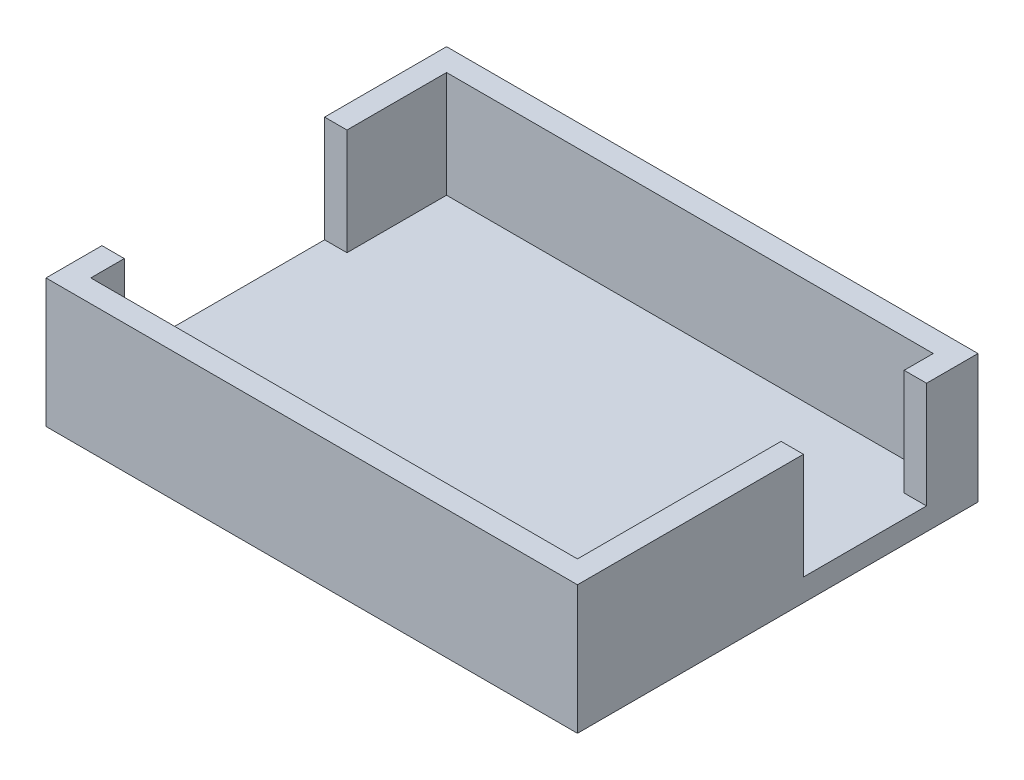
ISO-10303-21;
HEADER;
FILE_DESCRIPTION(('STEP AP214'),'2;1');
FILE_NAME('part.step','',(''),(''),'','','');
FILE_SCHEMA(('AUTOMOTIVE_DESIGN { 1 0 10303 214 1 1 1 1 }'));
ENDSEC;
DATA;
#1=APPLICATION_CONTEXT('core data for automotive mechanical design processes');
#2=APPLICATION_PROTOCOL_DEFINITION('international standard','automotive_design',2000,#1);
#3=PRODUCT_CONTEXT('',#1,'mechanical');
#4=PRODUCT('Part','Part','',(#3));
#5=PRODUCT_RELATED_PRODUCT_CATEGORY('part','',(#4));
#6=PRODUCT_DEFINITION_FORMATION('','',#4);
#7=PRODUCT_DEFINITION_CONTEXT('part definition',#1,'design');
#8=PRODUCT_DEFINITION('design','',#6,#7);
#9=PRODUCT_DEFINITION_SHAPE('','',#8);
#10=(LENGTH_UNIT() NAMED_UNIT(*) SI_UNIT(.MILLI.,.METRE.));
#11=(NAMED_UNIT(*) PLANE_ANGLE_UNIT() SI_UNIT($,.RADIAN.));
#12=(NAMED_UNIT(*) SI_UNIT($,.STERADIAN.) SOLID_ANGLE_UNIT());
#13=UNCERTAINTY_MEASURE_WITH_UNIT(LENGTH_MEASURE(1.E-05),#10,'distance_accuracy_value','');
#14=(GEOMETRIC_REPRESENTATION_CONTEXT(3) GLOBAL_UNCERTAINTY_ASSIGNED_CONTEXT((#13)) GLOBAL_UNIT_ASSIGNED_CONTEXT((#10,
#11,#12)) REPRESENTATION_CONTEXT('',''));
#15=CARTESIAN_POINT('',(0.,0.,0.));
#16=DIRECTION('',(0.,0.,1.));
#17=DIRECTION('',(1.,0.,0.));
#18=AXIS2_PLACEMENT_3D('',#15,#16,#17);
#19=CARTESIAN_POINT('',(0.,2.,0.));
#20=DIRECTION('',(0.,1.,0.));
#21=DIRECTION('',(0.,0.,1.));
#22=AXIS2_PLACEMENT_3D('',#19,#20,#21);
#23=PLANE('',#22);
#24=DIRECTION('',(-1.,0.,0.));
#25=VECTOR('',#24,1.);
#26=CARTESIAN_POINT('',(0.,2.,30.8));
#27=LINE('',#26,#25);
#28=CARTESIAN_POINT('',(2.,2.,30.8));
#29=VERTEX_POINT('',#28);
#30=CARTESIAN_POINT('',(0.,2.,30.8));
#31=VERTEX_POINT('',#30);
#32=EDGE_CURVE('E173',#29,#31,#27,.T.);
#33=ORIENTED_EDGE('',*,*,#32,.F.);
#34=DIRECTION('',(0.,0.,-1.));
#35=VECTOR('',#34,1.);
#36=CARTESIAN_POINT('',(2.,2.,33.8));
#37=LINE('',#36,#35);
#38=CARTESIAN_POINT('',(2.,2.,33.8));
#39=VERTEX_POINT('',#38);
#40=EDGE_CURVE('E563',#39,#29,#37,.T.);
#41=ORIENTED_EDGE('',*,*,#40,.F.);
#42=DIRECTION('',(-1.,0.,0.));
#43=VECTOR('',#42,1.);
#44=CARTESIAN_POINT('',(0.,2.,33.8));
#45=LINE('',#44,#43);
#46=CARTESIAN_POINT('',(45.5,2.,33.8));
#47=VERTEX_POINT('',#46);
#48=EDGE_CURVE('E181',#47,#39,#45,.T.);
#49=ORIENTED_EDGE('',*,*,#48,.F.);
#50=DIRECTION('',(0.,0.,1.));
#51=VECTOR('',#50,1.);
#52=CARTESIAN_POINT('',(45.5,2.,33.8));
#53=LINE('',#52,#51);
#54=CARTESIAN_POINT('',(45.5,2.,15.6));
#55=VERTEX_POINT('',#54);
#56=EDGE_CURVE('E314',#55,#47,#53,.T.);
#57=ORIENTED_EDGE('',*,*,#56,.F.);
#58=DIRECTION('',(-1.,0.,0.));
#59=VECTOR('',#58,1.);
#60=CARTESIAN_POINT('',(47.5,2.,15.6));
#61=LINE('',#60,#59);
#62=CARTESIAN_POINT('',(47.5,2.,15.6));
#63=VERTEX_POINT('',#62);
#64=EDGE_CURVE('E310',#63,#55,#61,.T.);
#65=ORIENTED_EDGE('',*,*,#64,.F.);
#66=DIRECTION('',(0.,0.,-1.));
#67=VECTOR('',#66,1.);
#68=CARTESIAN_POINT('',(47.5,2.,0.));
#69=LINE('',#68,#67);
#70=CARTESIAN_POINT('',(47.5,2.,4.6));
#71=VERTEX_POINT('',#70);
#72=EDGE_CURVE('E209',#63,#71,#69,.T.);
#73=ORIENTED_EDGE('',*,*,#72,.T.);
#74=DIRECTION('',(1.,0.,0.));
#75=VECTOR('',#74,1.);
#76=CARTESIAN_POINT('',(47.5,2.,4.6));
#77=LINE('',#76,#75);
#78=CARTESIAN_POINT('',(45.5,2.,4.6));
#79=VERTEX_POINT('',#78);
#80=EDGE_CURVE('E335',#79,#71,#77,.T.);
#81=ORIENTED_EDGE('',*,*,#80,.F.);
#82=DIRECTION('',(0.,0.,1.));
#83=VECTOR('',#82,1.);
#84=CARTESIAN_POINT('',(45.5,2.,2.));
#85=LINE('',#84,#83);
#86=CARTESIAN_POINT('',(45.5,2.,2.));
#87=VERTEX_POINT('',#86);
#88=EDGE_CURVE('E330',#87,#79,#85,.T.);
#89=ORIENTED_EDGE('',*,*,#88,.F.);
#90=DIRECTION('',(1.,0.,0.));
#91=VECTOR('',#90,1.);
#92=CARTESIAN_POINT('',(0.,2.,2.));
#93=LINE('',#92,#91);
#94=CARTESIAN_POINT('',(2.,2.,2.));
#95=VERTEX_POINT('',#94);
#96=EDGE_CURVE('E256',#95,#87,#93,.T.);
#97=ORIENTED_EDGE('',*,*,#96,.F.);
#98=DIRECTION('',(0.,0.,-1.));
#99=VECTOR('',#98,1.);
#100=CARTESIAN_POINT('',(2.,2.,2.));
#101=LINE('',#100,#99);
#102=CARTESIAN_POINT('',(2.,2.,10.9));
#103=VERTEX_POINT('',#102);
#104=EDGE_CURVE('E295',#103,#95,#101,.T.);
#105=ORIENTED_EDGE('',*,*,#104,.F.);
#106=DIRECTION('',(1.,0.,0.));
#107=VECTOR('',#106,1.);
#108=CARTESIAN_POINT('',(0.,2.,10.9));
#109=LINE('',#108,#107);
#110=CARTESIAN_POINT('',(0.,2.,10.9));
#111=VERTEX_POINT('',#110);
#112=EDGE_CURVE('E183',#111,#103,#109,.T.);
#113=ORIENTED_EDGE('',*,*,#112,.F.);
#114=DIRECTION('',(0.,0.,1.));
#115=VECTOR('',#114,1.);
#116=CARTESIAN_POINT('',(0.,2.,0.));
#117=LINE('',#116,#115);
#118=EDGE_CURVE('E205',#111,#31,#117,.T.);
#119=ORIENTED_EDGE('',*,*,#118,.T.);
#120=EDGE_LOOP('',(#33,#41,#49,#57,#65,#73,#81,#89,#97,#105,#113,#119));
#121=FACE_BOUND('',#120,.T.);
#122=ADVANCED_FACE('F45',(#121),#23,.T.);
#123=CARTESIAN_POINT('',(0.,11.5,33.8));
#124=DIRECTION('',(0.,0.,1.));
#125=DIRECTION('',(1.,0.,0.));
#126=AXIS2_PLACEMENT_3D('',#123,#124,#125);
#127=PLANE('',#126);
#128=DIRECTION('',(0.,-1.,0.));
#129=VECTOR('',#128,1.);
#130=CARTESIAN_POINT('',(2.,11.5,33.8));
#131=LINE('',#130,#129);
#132=CARTESIAN_POINT('',(2.,11.5,33.8));
#133=VERTEX_POINT('',#132);
#134=EDGE_CURVE('E163',#133,#39,#131,.T.);
#135=ORIENTED_EDGE('',*,*,#134,.F.);
#136=DIRECTION('',(-1.,0.,0.));
#137=VECTOR('',#136,1.);
#138=CARTESIAN_POINT('',(0.,11.5,33.8));
#139=LINE('',#138,#137);
#140=CARTESIAN_POINT('',(45.5,11.5,33.8));
#141=VERTEX_POINT('',#140);
#142=EDGE_CURVE('E179',#141,#133,#139,.T.);
#143=ORIENTED_EDGE('',*,*,#142,.F.);
#144=DIRECTION('',(0.,-1.,0.));
#145=VECTOR('',#144,1.);
#146=CARTESIAN_POINT('',(45.5,11.5,33.8));
#147=LINE('',#146,#145);
#148=EDGE_CURVE('E69',#141,#47,#147,.T.);
#149=ORIENTED_EDGE('',*,*,#148,.T.);
#150=ORIENTED_EDGE('',*,*,#48,.T.);
#151=EDGE_LOOP('',(#135,#143,#149,#150));
#152=FACE_BOUND('',#151,.T.);
#153=ADVANCED_FACE('F178',(#152),#127,.F.);
#154=CARTESIAN_POINT('',(0.,11.5,2.));
#155=DIRECTION('',(0.,0.,-1.));
#156=DIRECTION('',(-1.,0.,0.));
#157=AXIS2_PLACEMENT_3D('',#154,#155,#156);
#158=PLANE('',#157);
#159=DIRECTION('',(0.,-1.,0.));
#160=VECTOR('',#159,1.);
#161=CARTESIAN_POINT('',(2.,11.5,2.));
#162=LINE('',#161,#160);
#163=CARTESIAN_POINT('',(2.,11.5,2.));
#164=VERTEX_POINT('',#163);
#165=EDGE_CURVE('E61',#164,#95,#162,.T.);
#166=ORIENTED_EDGE('',*,*,#165,.T.);
#167=ORIENTED_EDGE('',*,*,#96,.T.);
#168=DIRECTION('',(0.,-1.,0.));
#169=VECTOR('',#168,1.);
#170=CARTESIAN_POINT('',(45.5,11.5,2.));
#171=LINE('',#170,#169);
#172=CARTESIAN_POINT('',(45.5,11.5,2.));
#173=VERTEX_POINT('',#172);
#174=EDGE_CURVE('E262',#173,#87,#171,.T.);
#175=ORIENTED_EDGE('',*,*,#174,.F.);
#176=DIRECTION('',(1.,0.,0.));
#177=VECTOR('',#176,1.);
#178=CARTESIAN_POINT('',(0.,11.5,2.));
#179=LINE('',#178,#177);
#180=EDGE_CURVE('E255',#164,#173,#179,.T.);
#181=ORIENTED_EDGE('',*,*,#180,.F.);
#182=EDGE_LOOP('',(#166,#167,#175,#181));
#183=FACE_BOUND('',#182,.T.);
#184=ADVANCED_FACE('F370',(#183),#158,.F.);
#185=CARTESIAN_POINT('',(0.,2.,0.));
#186=DIRECTION('',(1.,0.,0.));
#187=DIRECTION('',(0.,0.,-1.));
#188=AXIS2_PLACEMENT_3D('',#185,#186,#187);
#189=PLANE('',#188);
#190=DIRECTION('',(0.,0.,1.));
#191=VECTOR('',#190,1.);
#192=CARTESIAN_POINT('',(0.,0.,0.));
#193=LINE('',#192,#191);
#194=CARTESIAN_POINT('',(0.,0.,0.));
#195=VERTEX_POINT('',#194);
#196=CARTESIAN_POINT('',(0.,0.,35.8));
#197=VERTEX_POINT('',#196);
#198=EDGE_CURVE('E189',#195,#197,#193,.T.);
#199=ORIENTED_EDGE('',*,*,#198,.T.);
#200=DIRECTION('',(0.,-1.,0.));
#201=VECTOR('',#200,1.);
#202=CARTESIAN_POINT('',(0.,2.,35.8));
#203=LINE('',#202,#201);
#204=CARTESIAN_POINT('',(0.,11.5,35.8));
#205=VERTEX_POINT('',#204);
#206=EDGE_CURVE('E11',#205,#197,#203,.T.);
#207=ORIENTED_EDGE('',*,*,#206,.F.);
#208=DIRECTION('',(0.,0.,1.));
#209=VECTOR('',#208,1.);
#210=CARTESIAN_POINT('',(0.,11.5,35.8));
#211=LINE('',#210,#209);
#212=CARTESIAN_POINT('',(0.,11.5,30.8));
#213=VERTEX_POINT('',#212);
#214=EDGE_CURVE('E203',#213,#205,#211,.T.);
#215=ORIENTED_EDGE('',*,*,#214,.F.);
#216=DIRECTION('',(0.,-1.,0.));
#217=VECTOR('',#216,1.);
#218=CARTESIAN_POINT('',(0.,11.5,30.8));
#219=LINE('',#218,#217);
#220=EDGE_CURVE('E278',#213,#31,#219,.T.);
#221=ORIENTED_EDGE('',*,*,#220,.T.);
#222=ORIENTED_EDGE('',*,*,#118,.F.);
#223=DIRECTION('',(0.,-1.,0.));
#224=VECTOR('',#223,1.);
#225=CARTESIAN_POINT('',(0.,11.5,10.9));
#226=LINE('',#225,#224);
#227=CARTESIAN_POINT('',(0.,11.5,10.9));
#228=VERTEX_POINT('',#227);
#229=EDGE_CURVE('E251',#228,#111,#226,.T.);
#230=ORIENTED_EDGE('',*,*,#229,.F.);
#231=DIRECTION('',(0.,0.,1.));
#232=VECTOR('',#231,1.);
#233=CARTESIAN_POINT('',(0.,11.5,0.));
#234=LINE('',#233,#232);
#235=CARTESIAN_POINT('',(0.,11.5,0.));
#236=VERTEX_POINT('',#235);
#237=EDGE_CURVE('E249',#236,#228,#234,.T.);
#238=ORIENTED_EDGE('',*,*,#237,.F.);
#239=DIRECTION('',(0.,-1.,0.));
#240=VECTOR('',#239,1.);
#241=CARTESIAN_POINT('',(0.,2.,0.));
#242=LINE('',#241,#240);
#243=EDGE_CURVE('E212',#236,#195,#242,.T.);
#244=ORIENTED_EDGE('',*,*,#243,.T.);
#245=EDGE_LOOP('',(#199,#207,#215,#221,#222,#230,#238,#244));
#246=FACE_BOUND('',#245,.T.);
#247=ADVANCED_FACE('F47',(#246),#189,.F.);
#248=CARTESIAN_POINT('',(0.,2.,35.8));
#249=DIRECTION('',(0.,0.,-1.));
#250=DIRECTION('',(-1.,0.,0.));
#251=AXIS2_PLACEMENT_3D('',#248,#249,#250);
#252=PLANE('',#251);
#253=DIRECTION('',(1.,0.,0.));
#254=VECTOR('',#253,1.);
#255=CARTESIAN_POINT('',(0.,0.,35.8));
#256=LINE('',#255,#254);
#257=CARTESIAN_POINT('',(47.5,0.,35.8));
#258=VERTEX_POINT('',#257);
#259=EDGE_CURVE('E195',#197,#258,#256,.T.);
#260=ORIENTED_EDGE('',*,*,#259,.T.);
#261=DIRECTION('',(0.,-1.,0.));
#262=VECTOR('',#261,1.);
#263=CARTESIAN_POINT('',(47.5,2.,35.8));
#264=LINE('',#263,#262);
#265=CARTESIAN_POINT('',(47.5,11.5,35.8));
#266=VERTEX_POINT('',#265);
#267=EDGE_CURVE('E54',#266,#258,#264,.T.);
#268=ORIENTED_EDGE('',*,*,#267,.F.);
#269=DIRECTION('',(1.,0.,0.));
#270=VECTOR('',#269,1.);
#271=CARTESIAN_POINT('',(0.,11.5,35.8));
#272=LINE('',#271,#270);
#273=EDGE_CURVE('E197',#205,#266,#272,.T.);
#274=ORIENTED_EDGE('',*,*,#273,.F.);
#275=ORIENTED_EDGE('',*,*,#206,.T.);
#276=EDGE_LOOP('',(#260,#268,#274,#275));
#277=FACE_BOUND('',#276,.T.);
#278=ADVANCED_FACE('F275',(#277),#252,.F.);
#279=CARTESIAN_POINT('',(47.5,2.,0.));
#280=DIRECTION('',(-1.,0.,0.));
#281=DIRECTION('',(0.,0.,1.));
#282=AXIS2_PLACEMENT_3D('',#279,#280,#281);
#283=PLANE('',#282);
#284=ORIENTED_EDGE('',*,*,#72,.F.);
#285=DIRECTION('',(0.,-1.,0.));
#286=VECTOR('',#285,1.);
#287=CARTESIAN_POINT('',(47.5,11.5,15.6));
#288=LINE('',#287,#286);
#289=CARTESIAN_POINT('',(47.5,11.5,15.6));
#290=VERTEX_POINT('',#289);
#291=EDGE_CURVE('E327',#290,#63,#288,.T.);
#292=ORIENTED_EDGE('',*,*,#291,.F.);
#293=DIRECTION('',(0.,0.,-1.));
#294=VECTOR('',#293,1.);
#295=CARTESIAN_POINT('',(47.5,11.5,35.8));
#296=LINE('',#295,#294);
#297=EDGE_CURVE('E190',#266,#290,#296,.T.);
#298=ORIENTED_EDGE('',*,*,#297,.F.);
#299=ORIENTED_EDGE('',*,*,#267,.T.);
#300=DIRECTION('',(0.,0.,-1.));
#301=VECTOR('',#300,1.);
#302=CARTESIAN_POINT('',(47.5,0.,0.));
#303=LINE('',#302,#301);
#304=CARTESIAN_POINT('',(47.5,0.,0.));
#305=VERTEX_POINT('',#304);
#306=EDGE_CURVE('E216',#258,#305,#303,.T.);
#307=ORIENTED_EDGE('',*,*,#306,.T.);
#308=DIRECTION('',(0.,-1.,0.));
#309=VECTOR('',#308,1.);
#310=CARTESIAN_POINT('',(47.5,2.,0.));
#311=LINE('',#310,#309);
#312=CARTESIAN_POINT('',(47.5,11.5,0.));
#313=VERTEX_POINT('',#312);
#314=EDGE_CURVE('E224',#313,#305,#311,.T.);
#315=ORIENTED_EDGE('',*,*,#314,.F.);
#316=DIRECTION('',(0.,0.,-1.));
#317=VECTOR('',#316,1.);
#318=CARTESIAN_POINT('',(47.5,11.5,0.));
#319=LINE('',#318,#317);
#320=CARTESIAN_POINT('',(47.5,11.5,4.6));
#321=VERTEX_POINT('',#320);
#322=EDGE_CURVE('E260',#321,#313,#319,.T.);
#323=ORIENTED_EDGE('',*,*,#322,.F.);
#324=DIRECTION('',(0.,-1.,0.));
#325=VECTOR('',#324,1.);
#326=CARTESIAN_POINT('',(47.5,11.5,4.6));
#327=LINE('',#326,#325);
#328=EDGE_CURVE('E339',#321,#71,#327,.T.);
#329=ORIENTED_EDGE('',*,*,#328,.T.);
#330=EDGE_LOOP('',(#284,#292,#298,#299,#307,#315,#323,#329));
#331=FACE_BOUND('',#330,.T.);
#332=ADVANCED_FACE('F233',(#331),#283,.F.);
#333=CARTESIAN_POINT('',(0.,2.,0.));
#334=DIRECTION('',(0.,0.,1.));
#335=DIRECTION('',(1.,0.,0.));
#336=AXIS2_PLACEMENT_3D('',#333,#334,#335);
#337=PLANE('',#336);
#338=DIRECTION('',(-1.,0.,0.));
#339=VECTOR('',#338,1.);
#340=CARTESIAN_POINT('',(0.,0.,0.));
#341=LINE('',#340,#339);
#342=EDGE_CURVE('E210',#305,#195,#341,.T.);
#343=ORIENTED_EDGE('',*,*,#342,.T.);
#344=ORIENTED_EDGE('',*,*,#243,.F.);
#345=DIRECTION('',(-1.,0.,0.));
#346=VECTOR('',#345,1.);
#347=CARTESIAN_POINT('',(0.,11.5,0.));
#348=LINE('',#347,#346);
#349=EDGE_CURVE('E204',#313,#236,#348,.T.);
#350=ORIENTED_EDGE('',*,*,#349,.F.);
#351=ORIENTED_EDGE('',*,*,#314,.T.);
#352=EDGE_LOOP('',(#343,#344,#350,#351));
#353=FACE_BOUND('',#352,.T.);
#354=ADVANCED_FACE('F243',(#353),#337,.F.);
#355=CARTESIAN_POINT('',(0.,0.,0.));
#356=DIRECTION('',(0.,1.,0.));
#357=DIRECTION('',(0.,0.,1.));
#358=AXIS2_PLACEMENT_3D('',#355,#356,#357);
#359=PLANE('',#358);
#360=ORIENTED_EDGE('',*,*,#198,.F.);
#361=ORIENTED_EDGE('',*,*,#342,.F.);
#362=ORIENTED_EDGE('',*,*,#306,.F.);
#363=ORIENTED_EDGE('',*,*,#259,.F.);
#364=EDGE_LOOP('',(#360,#361,#362,#363));
#365=FACE_BOUND('',#364,.T.);
#366=ADVANCED_FACE('F241',(#365),#359,.F.);
#367=CARTESIAN_POINT('',(0.,11.5,0.));
#368=DIRECTION('',(0.,-1.,0.));
#369=DIRECTION('',(0.,0.,-1.));
#370=AXIS2_PLACEMENT_3D('',#367,#368,#369);
#371=PLANE('',#370);
#372=ORIENTED_EDGE('',*,*,#214,.T.);
#373=ORIENTED_EDGE('',*,*,#273,.T.);
#374=ORIENTED_EDGE('',*,*,#297,.T.);
#375=DIRECTION('',(-1.,0.,0.));
#376=VECTOR('',#375,1.);
#377=CARTESIAN_POINT('',(47.5,11.5,15.6));
#378=LINE('',#377,#376);
#379=CARTESIAN_POINT('',(45.5,11.5,15.6));
#380=VERTEX_POINT('',#379);
#381=EDGE_CURVE('E311',#290,#380,#378,.T.);
#382=ORIENTED_EDGE('',*,*,#381,.T.);
#383=DIRECTION('',(0.,0.,1.));
#384=VECTOR('',#383,1.);
#385=CARTESIAN_POINT('',(45.5,11.5,33.8));
#386=LINE('',#385,#384);
#387=EDGE_CURVE('E187',#380,#141,#386,.T.);
#388=ORIENTED_EDGE('',*,*,#387,.T.);
#389=ORIENTED_EDGE('',*,*,#142,.T.);
#390=DIRECTION('',(0.,0.,-1.));
#391=VECTOR('',#390,1.);
#392=CARTESIAN_POINT('',(2.,11.5,33.8));
#393=LINE('',#392,#391);
#394=CARTESIAN_POINT('',(2.,11.5,30.8));
#395=VERTEX_POINT('',#394);
#396=EDGE_CURVE('E160',#133,#395,#393,.T.);
#397=ORIENTED_EDGE('',*,*,#396,.T.);
#398=DIRECTION('',(-1.,0.,0.));
#399=VECTOR('',#398,1.);
#400=CARTESIAN_POINT('',(0.,11.5,30.8));
#401=LINE('',#400,#399);
#402=EDGE_CURVE('E172',#395,#213,#401,.T.);
#403=ORIENTED_EDGE('',*,*,#402,.T.);
#404=EDGE_LOOP('',(#372,#373,#374,#382,#388,#389,#397,#403));
#405=FACE_BOUND('',#404,.T.);
#406=ADVANCED_FACE('F186',(#405),#371,.F.);
#407=CARTESIAN_POINT('',(0.,11.5,0.));
#408=DIRECTION('',(0.,1.,0.));
#409=DIRECTION('',(0.,0.,1.));
#410=AXIS2_PLACEMENT_3D('',#407,#408,#409);
#411=PLANE('',#410);
#412=ORIENTED_EDGE('',*,*,#237,.T.);
#413=DIRECTION('',(1.,0.,0.));
#414=VECTOR('',#413,1.);
#415=CARTESIAN_POINT('',(0.,11.5,10.9));
#416=LINE('',#415,#414);
#417=CARTESIAN_POINT('',(2.,11.5,10.9));
#418=VERTEX_POINT('',#417);
#419=EDGE_CURVE('E291',#228,#418,#416,.T.);
#420=ORIENTED_EDGE('',*,*,#419,.T.);
#421=DIRECTION('',(0.,0.,-1.));
#422=VECTOR('',#421,1.);
#423=CARTESIAN_POINT('',(2.,11.5,2.));
#424=LINE('',#423,#422);
#425=EDGE_CURVE('E294',#418,#164,#424,.T.);
#426=ORIENTED_EDGE('',*,*,#425,.T.);
#427=ORIENTED_EDGE('',*,*,#180,.T.);
#428=DIRECTION('',(0.,0.,1.));
#429=VECTOR('',#428,1.);
#430=CARTESIAN_POINT('',(45.5,11.5,2.));
#431=LINE('',#430,#429);
#432=CARTESIAN_POINT('',(45.5,11.5,4.6));
#433=VERTEX_POINT('',#432);
#434=EDGE_CURVE('E331',#173,#433,#431,.T.);
#435=ORIENTED_EDGE('',*,*,#434,.T.);
#436=DIRECTION('',(1.,0.,0.));
#437=VECTOR('',#436,1.);
#438=CARTESIAN_POINT('',(47.5,11.5,4.6));
#439=LINE('',#438,#437);
#440=EDGE_CURVE('E334',#433,#321,#439,.T.);
#441=ORIENTED_EDGE('',*,*,#440,.T.);
#442=ORIENTED_EDGE('',*,*,#322,.T.);
#443=ORIENTED_EDGE('',*,*,#349,.T.);
#444=EDGE_LOOP('',(#412,#420,#426,#427,#435,#441,#442,#443));
#445=FACE_BOUND('',#444,.T.);
#446=ADVANCED_FACE('F369',(#445),#411,.T.);
#447=CARTESIAN_POINT('',(45.5,11.5,2.));
#448=DIRECTION('',(1.,0.,0.));
#449=DIRECTION('',(0.,0.,-1.));
#450=AXIS2_PLACEMENT_3D('',#447,#448,#449);
#451=PLANE('',#450);
#452=ORIENTED_EDGE('',*,*,#88,.T.);
#453=DIRECTION('',(0.,-1.,0.));
#454=VECTOR('',#453,1.);
#455=CARTESIAN_POINT('',(45.5,11.5,4.6));
#456=LINE('',#455,#454);
#457=EDGE_CURVE('E347',#433,#79,#456,.T.);
#458=ORIENTED_EDGE('',*,*,#457,.F.);
#459=ORIENTED_EDGE('',*,*,#434,.F.);
#460=ORIENTED_EDGE('',*,*,#174,.T.);
#461=EDGE_LOOP('',(#452,#458,#459,#460));
#462=FACE_BOUND('',#461,.T.);
#463=ADVANCED_FACE('F360',(#462),#451,.F.);
#464=CARTESIAN_POINT('',(47.5,11.5,4.6));
#465=DIRECTION('',(0.,0.,-1.));
#466=DIRECTION('',(-1.,0.,0.));
#467=AXIS2_PLACEMENT_3D('',#464,#465,#466);
#468=PLANE('',#467);
#469=ORIENTED_EDGE('',*,*,#80,.T.);
#470=ORIENTED_EDGE('',*,*,#328,.F.);
#471=ORIENTED_EDGE('',*,*,#440,.F.);
#472=ORIENTED_EDGE('',*,*,#457,.T.);
#473=EDGE_LOOP('',(#469,#470,#471,#472));
#474=FACE_BOUND('',#473,.T.);
#475=ADVANCED_FACE('F368',(#474),#468,.F.);
#476=CARTESIAN_POINT('',(47.5,11.5,15.6));
#477=DIRECTION('',(0.,0.,1.));
#478=DIRECTION('',(1.,0.,0.));
#479=AXIS2_PLACEMENT_3D('',#476,#477,#478);
#480=PLANE('',#479);
#481=ORIENTED_EDGE('',*,*,#64,.T.);
#482=DIRECTION('',(0.,-1.,0.));
#483=VECTOR('',#482,1.);
#484=CARTESIAN_POINT('',(45.5,11.5,15.6));
#485=LINE('',#484,#483);
#486=EDGE_CURVE('E323',#380,#55,#485,.T.);
#487=ORIENTED_EDGE('',*,*,#486,.F.);
#488=ORIENTED_EDGE('',*,*,#381,.F.);
#489=ORIENTED_EDGE('',*,*,#291,.T.);
#490=EDGE_LOOP('',(#481,#487,#488,#489));
#491=FACE_BOUND('',#490,.T.);
#492=ADVANCED_FACE('F421',(#491),#480,.F.);
#493=CARTESIAN_POINT('',(45.5,11.5,33.8));
#494=DIRECTION('',(1.,0.,0.));
#495=DIRECTION('',(0.,0.,-1.));
#496=AXIS2_PLACEMENT_3D('',#493,#494,#495);
#497=PLANE('',#496);
#498=ORIENTED_EDGE('',*,*,#56,.T.);
#499=ORIENTED_EDGE('',*,*,#148,.F.);
#500=ORIENTED_EDGE('',*,*,#387,.F.);
#501=ORIENTED_EDGE('',*,*,#486,.T.);
#502=EDGE_LOOP('',(#498,#499,#500,#501));
#503=FACE_BOUND('',#502,.T.);
#504=ADVANCED_FACE('F435',(#503),#497,.F.);
#505=CARTESIAN_POINT('',(0.,11.5,10.9));
#506=DIRECTION('',(0.,0.,-1.));
#507=DIRECTION('',(-1.,0.,0.));
#508=AXIS2_PLACEMENT_3D('',#505,#506,#507);
#509=PLANE('',#508);
#510=ORIENTED_EDGE('',*,*,#112,.T.);
#511=DIRECTION('',(0.,-1.,0.));
#512=VECTOR('',#511,1.);
#513=CARTESIAN_POINT('',(2.,11.5,10.9));
#514=LINE('',#513,#512);
#515=EDGE_CURVE('E304',#418,#103,#514,.T.);
#516=ORIENTED_EDGE('',*,*,#515,.F.);
#517=ORIENTED_EDGE('',*,*,#419,.F.);
#518=ORIENTED_EDGE('',*,*,#229,.T.);
#519=EDGE_LOOP('',(#510,#516,#517,#518));
#520=FACE_BOUND('',#519,.T.);
#521=ADVANCED_FACE('F443',(#520),#509,.F.);
#522=CARTESIAN_POINT('',(2.,11.5,2.));
#523=DIRECTION('',(-1.,0.,0.));
#524=DIRECTION('',(0.,0.,1.));
#525=AXIS2_PLACEMENT_3D('',#522,#523,#524);
#526=PLANE('',#525);
#527=ORIENTED_EDGE('',*,*,#104,.T.);
#528=ORIENTED_EDGE('',*,*,#165,.F.);
#529=ORIENTED_EDGE('',*,*,#425,.F.);
#530=ORIENTED_EDGE('',*,*,#515,.T.);
#531=EDGE_LOOP('',(#527,#528,#529,#530));
#532=FACE_BOUND('',#531,.T.);
#533=ADVANCED_FACE('F477',(#532),#526,.F.);
#534=CARTESIAN_POINT('',(2.,11.5,33.8));
#535=DIRECTION('',(-1.,0.,0.));
#536=DIRECTION('',(0.,0.,1.));
#537=AXIS2_PLACEMENT_3D('',#534,#535,#536);
#538=PLANE('',#537);
#539=ORIENTED_EDGE('',*,*,#40,.T.);
#540=DIRECTION('',(0.,-1.,0.));
#541=VECTOR('',#540,1.);
#542=CARTESIAN_POINT('',(2.,11.5,30.8));
#543=LINE('',#542,#541);
#544=EDGE_CURVE('E166',#395,#29,#543,.T.);
#545=ORIENTED_EDGE('',*,*,#544,.F.);
#546=ORIENTED_EDGE('',*,*,#396,.F.);
#547=ORIENTED_EDGE('',*,*,#134,.T.);
#548=EDGE_LOOP('',(#539,#545,#546,#547));
#549=FACE_BOUND('',#548,.T.);
#550=ADVANCED_FACE('F162',(#549),#538,.F.);
#551=CARTESIAN_POINT('',(0.,11.5,30.8));
#552=DIRECTION('',(0.,0.,1.));
#553=DIRECTION('',(1.,0.,0.));
#554=AXIS2_PLACEMENT_3D('',#551,#552,#553);
#555=PLANE('',#554);
#556=ORIENTED_EDGE('',*,*,#32,.T.);
#557=ORIENTED_EDGE('',*,*,#220,.F.);
#558=ORIENTED_EDGE('',*,*,#402,.F.);
#559=ORIENTED_EDGE('',*,*,#544,.T.);
#560=EDGE_LOOP('',(#556,#557,#558,#559));
#561=FACE_BOUND('',#560,.T.);
#562=ADVANCED_FACE('F282',(#561),#555,.F.);
#563=CLOSED_SHELL('',(#122,#153,#184,#247,#278,#332,#354,#366,#406,#446,#463,#475,#492,#504,
#521,#533,#550,#562));
#564=MANIFOLD_SOLID_BREP('B2',#563);
#565=ADVANCED_BREP_SHAPE_REPRESENTATION('',(#18,#564),#14);
#566=SHAPE_DEFINITION_REPRESENTATION(#9,#565);
ENDSEC;
END-ISO-10303-21;
